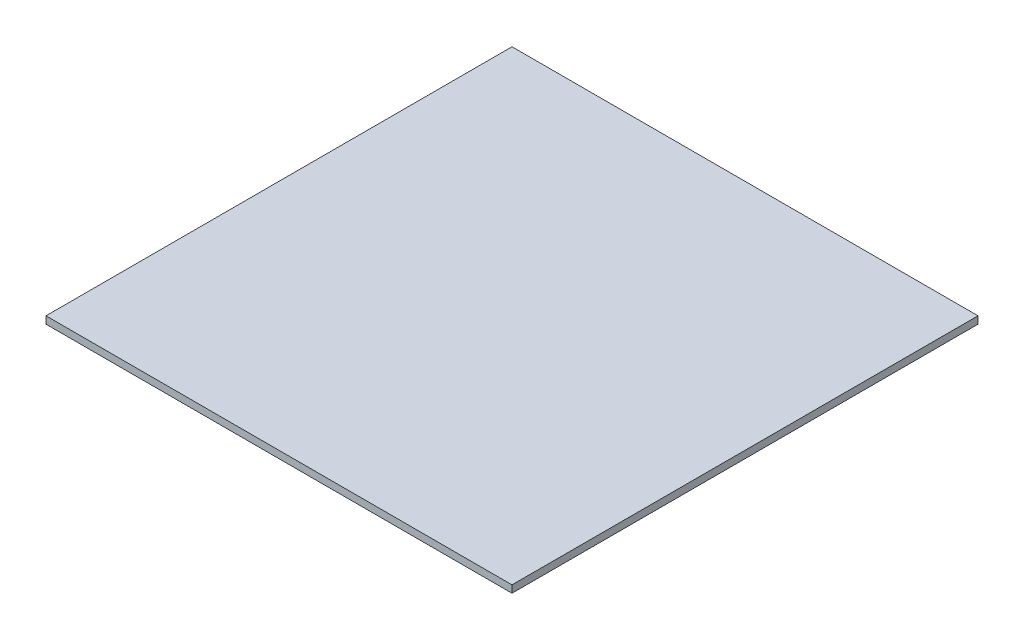
ISO-10303-21;
HEADER;
FILE_DESCRIPTION(('STEP AP214'),'2;1');
FILE_NAME('part.step','',(''),(''),'','','');
FILE_SCHEMA(('AUTOMOTIVE_DESIGN { 1 0 10303 214 1 1 1 1 }'));
ENDSEC;
DATA;
#1=APPLICATION_CONTEXT('core data for automotive mechanical design processes');
#2=APPLICATION_PROTOCOL_DEFINITION('international standard','automotive_design',2000,#1);
#3=PRODUCT_CONTEXT('',#1,'mechanical');
#4=PRODUCT('Part','Part','',(#3));
#5=PRODUCT_RELATED_PRODUCT_CATEGORY('part','',(#4));
#6=PRODUCT_DEFINITION_FORMATION('','',#4);
#7=PRODUCT_DEFINITION_CONTEXT('part definition',#1,'design');
#8=PRODUCT_DEFINITION('design','',#6,#7);
#9=PRODUCT_DEFINITION_SHAPE('','',#8);
#10=(LENGTH_UNIT() NAMED_UNIT(*) SI_UNIT(.MILLI.,.METRE.));
#11=(NAMED_UNIT(*) PLANE_ANGLE_UNIT() SI_UNIT($,.RADIAN.));
#12=(NAMED_UNIT(*) SI_UNIT($,.STERADIAN.) SOLID_ANGLE_UNIT());
#13=UNCERTAINTY_MEASURE_WITH_UNIT(LENGTH_MEASURE(1.E-05),#10,'distance_accuracy_value','');
#14=(GEOMETRIC_REPRESENTATION_CONTEXT(3) GLOBAL_UNCERTAINTY_ASSIGNED_CONTEXT((#13)) GLOBAL_UNIT_ASSIGNED_CONTEXT((#10,
#11,#12)) REPRESENTATION_CONTEXT('',''));
#15=CARTESIAN_POINT('',(0.,0.,0.));
#16=DIRECTION('',(0.,0.,1.));
#17=DIRECTION('',(1.,0.,0.));
#18=AXIS2_PLACEMENT_3D('',#15,#16,#17);
#19=CARTESIAN_POINT('',(-609.6,-19.05,-1219.2));
#20=DIRECTION('',(-1.,0.,0.));
#21=DIRECTION('',(0.,0.,1.));
#22=AXIS2_PLACEMENT_3D('',#19,#20,#21);
#23=PLANE('',#22);
#24=DIRECTION('',(0.,0.,1.));
#25=VECTOR('',#24,1.);
#26=CARTESIAN_POINT('',(-609.6,0.,-1219.2));
#27=LINE('',#26,#25);
#28=CARTESIAN_POINT('',(-609.6,0.,-1219.2));
#29=VERTEX_POINT('',#28);
#30=CARTESIAN_POINT('',(-609.6,0.,0.));
#31=VERTEX_POINT('',#30);
#32=EDGE_CURVE('E96',#29,#31,#27,.T.);
#33=ORIENTED_EDGE('',*,*,#32,.F.);
#34=DIRECTION('',(0.,1.,0.));
#35=VECTOR('',#34,1.);
#36=CARTESIAN_POINT('',(-609.6,-19.05,-1219.2));
#37=LINE('',#36,#35);
#38=CARTESIAN_POINT('',(-609.6,-19.05,-1219.2));
#39=VERTEX_POINT('',#38);
#40=EDGE_CURVE('E11',#39,#29,#37,.T.);
#41=ORIENTED_EDGE('',*,*,#40,.F.);
#42=DIRECTION('',(0.,0.,1.));
#43=VECTOR('',#42,1.);
#44=CARTESIAN_POINT('',(-609.6,-19.05,-1219.2));
#45=LINE('',#44,#43);
#46=CARTESIAN_POINT('',(-609.6,-19.05,0.));
#47=VERTEX_POINT('',#46);
#48=EDGE_CURVE('E90',#39,#47,#45,.T.);
#49=ORIENTED_EDGE('',*,*,#48,.T.);
#50=DIRECTION('',(0.,1.,0.));
#51=VECTOR('',#50,1.);
#52=CARTESIAN_POINT('',(-609.6,-19.05,0.));
#53=LINE('',#52,#51);
#54=EDGE_CURVE('E35',#47,#31,#53,.T.);
#55=ORIENTED_EDGE('',*,*,#54,.T.);
#56=EDGE_LOOP('',(#33,#41,#49,#55));
#57=FACE_BOUND('',#56,.T.);
#58=ADVANCED_FACE('F32',(#57),#23,.T.);
#59=CARTESIAN_POINT('',(-609.6,-19.05,-1219.2));
#60=DIRECTION('',(0.,0.,-1.));
#61=DIRECTION('',(-1.,0.,0.));
#62=AXIS2_PLACEMENT_3D('',#59,#60,#61);
#63=PLANE('',#62);
#64=DIRECTION('',(-1.,0.,0.));
#65=VECTOR('',#64,1.);
#66=CARTESIAN_POINT('',(-609.6,0.,-1219.2));
#67=LINE('',#66,#65);
#68=CARTESIAN_POINT('',(609.6,0.,-1219.2));
#69=VERTEX_POINT('',#68);
#70=EDGE_CURVE('E92',#69,#29,#67,.T.);
#71=ORIENTED_EDGE('',*,*,#70,.F.);
#72=DIRECTION('',(0.,1.,0.));
#73=VECTOR('',#72,1.);
#74=CARTESIAN_POINT('',(609.6,-19.05,-1219.2));
#75=LINE('',#74,#73);
#76=CARTESIAN_POINT('',(609.6,-19.05,-1219.2));
#77=VERTEX_POINT('',#76);
#78=EDGE_CURVE('E41',#77,#69,#75,.T.);
#79=ORIENTED_EDGE('',*,*,#78,.F.);
#80=DIRECTION('',(-1.,0.,0.));
#81=VECTOR('',#80,1.);
#82=CARTESIAN_POINT('',(-609.6,-19.05,-1219.2));
#83=LINE('',#82,#81);
#84=EDGE_CURVE('E87',#77,#39,#83,.T.);
#85=ORIENTED_EDGE('',*,*,#84,.T.);
#86=ORIENTED_EDGE('',*,*,#40,.T.);
#87=EDGE_LOOP('',(#71,#79,#85,#86));
#88=FACE_BOUND('',#87,.T.);
#89=ADVANCED_FACE('F106',(#88),#63,.T.);
#90=CARTESIAN_POINT('',(609.6,-19.05,-1219.2));
#91=DIRECTION('',(1.,0.,0.));
#92=DIRECTION('',(0.,0.,-1.));
#93=AXIS2_PLACEMENT_3D('',#90,#91,#92);
#94=PLANE('',#93);
#95=DIRECTION('',(0.,0.,-1.));
#96=VECTOR('',#95,1.);
#97=CARTESIAN_POINT('',(609.6,0.,-1219.2));
#98=LINE('',#97,#96);
#99=CARTESIAN_POINT('',(609.6,0.,0.));
#100=VERTEX_POINT('',#99);
#101=EDGE_CURVE('E82',#100,#69,#98,.T.);
#102=ORIENTED_EDGE('',*,*,#101,.F.);
#103=DIRECTION('',(0.,1.,0.));
#104=VECTOR('',#103,1.);
#105=CARTESIAN_POINT('',(609.6,-19.05,0.));
#106=LINE('',#105,#104);
#107=CARTESIAN_POINT('',(609.6,-19.05,0.));
#108=VERTEX_POINT('',#107);
#109=EDGE_CURVE('E77',#108,#100,#106,.T.);
#110=ORIENTED_EDGE('',*,*,#109,.F.);
#111=DIRECTION('',(0.,0.,-1.));
#112=VECTOR('',#111,1.);
#113=CARTESIAN_POINT('',(609.6,-19.05,-1219.2));
#114=LINE('',#113,#112);
#115=EDGE_CURVE('E80',#108,#77,#114,.T.);
#116=ORIENTED_EDGE('',*,*,#115,.T.);
#117=ORIENTED_EDGE('',*,*,#78,.T.);
#118=EDGE_LOOP('',(#102,#110,#116,#117));
#119=FACE_BOUND('',#118,.T.);
#120=ADVANCED_FACE('F79',(#119),#94,.T.);
#121=CARTESIAN_POINT('',(-609.6,-19.05,0.));
#122=DIRECTION('',(0.,0.,1.));
#123=DIRECTION('',(1.,0.,0.));
#124=AXIS2_PLACEMENT_3D('',#121,#122,#123);
#125=PLANE('',#124);
#126=DIRECTION('',(1.,0.,0.));
#127=VECTOR('',#126,1.);
#128=CARTESIAN_POINT('',(-609.6,0.,0.));
#129=LINE('',#128,#127);
#130=EDGE_CURVE('E99',#31,#100,#129,.T.);
#131=ORIENTED_EDGE('',*,*,#130,.F.);
#132=ORIENTED_EDGE('',*,*,#54,.F.);
#133=DIRECTION('',(1.,0.,0.));
#134=VECTOR('',#133,1.);
#135=CARTESIAN_POINT('',(-609.6,-19.05,0.));
#136=LINE('',#135,#134);
#137=EDGE_CURVE('E86',#47,#108,#136,.T.);
#138=ORIENTED_EDGE('',*,*,#137,.T.);
#139=ORIENTED_EDGE('',*,*,#109,.T.);
#140=EDGE_LOOP('',(#131,#132,#138,#139));
#141=FACE_BOUND('',#140,.T.);
#142=ADVANCED_FACE('F89',(#141),#125,.T.);
#143=CARTESIAN_POINT('',(-609.6,-19.05,-1219.2));
#144=DIRECTION('',(0.,1.,0.));
#145=DIRECTION('',(0.,0.,1.));
#146=AXIS2_PLACEMENT_3D('',#143,#144,#145);
#147=PLANE('',#146);
#148=ORIENTED_EDGE('',*,*,#48,.F.);
#149=ORIENTED_EDGE('',*,*,#84,.F.);
#150=ORIENTED_EDGE('',*,*,#115,.F.);
#151=ORIENTED_EDGE('',*,*,#137,.F.);
#152=EDGE_LOOP('',(#148,#149,#150,#151));
#153=FACE_BOUND('',#152,.T.);
#154=ADVANCED_FACE('F85',(#153),#147,.F.);
#155=CARTESIAN_POINT('',(-609.6,0.,-1219.2));
#156=DIRECTION('',(0.,1.,0.));
#157=DIRECTION('',(0.,0.,1.));
#158=AXIS2_PLACEMENT_3D('',#155,#156,#157);
#159=PLANE('',#158);
#160=ORIENTED_EDGE('',*,*,#32,.T.);
#161=ORIENTED_EDGE('',*,*,#130,.T.);
#162=ORIENTED_EDGE('',*,*,#101,.T.);
#163=ORIENTED_EDGE('',*,*,#70,.T.);
#164=EDGE_LOOP('',(#160,#161,#162,#163));
#165=FACE_BOUND('',#164,.T.);
#166=ADVANCED_FACE('F105',(#165),#159,.T.);
#167=CLOSED_SHELL('',(#58,#89,#120,#142,#154,#166));
#168=MANIFOLD_SOLID_BREP('B2',#167);
#169=ADVANCED_BREP_SHAPE_REPRESENTATION('',(#18,#168),#14);
#170=SHAPE_DEFINITION_REPRESENTATION(#9,#169);
ENDSEC;
END-ISO-10303-21;
